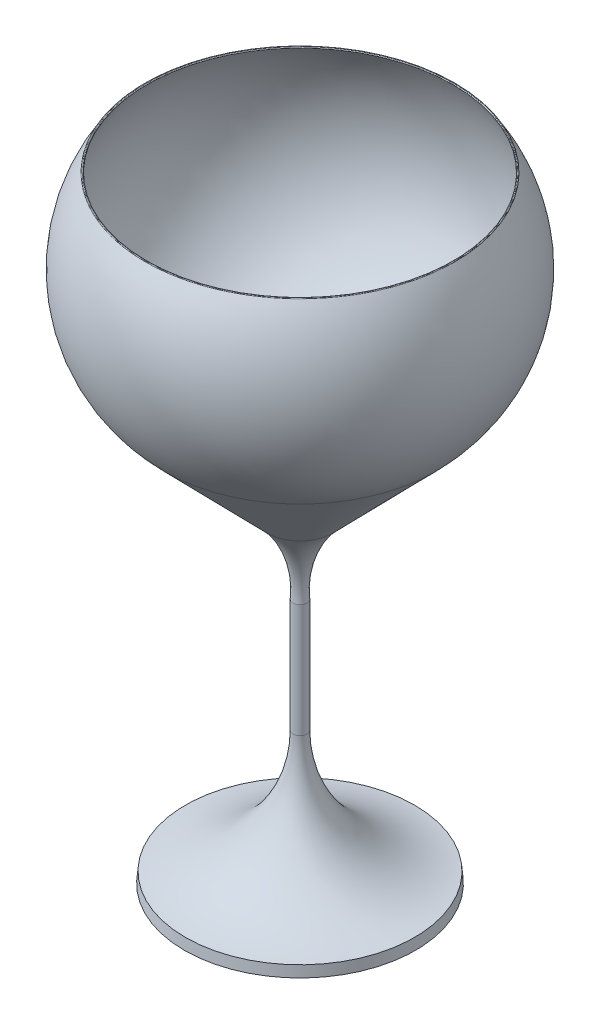
ISO-10303-21;
HEADER;
FILE_DESCRIPTION(('STEP AP214'),'2;1');
FILE_NAME('part.step','',(''),(''),'','','');
FILE_SCHEMA(('AUTOMOTIVE_DESIGN { 1 0 10303 214 1 1 1 1 }'));
ENDSEC;
DATA;
#1=APPLICATION_CONTEXT('core data for automotive mechanical design processes');
#2=APPLICATION_PROTOCOL_DEFINITION('international standard','automotive_design',2000,#1);
#3=PRODUCT_CONTEXT('',#1,'mechanical');
#4=PRODUCT('Part','Part','',(#3));
#5=PRODUCT_RELATED_PRODUCT_CATEGORY('part','',(#4));
#6=PRODUCT_DEFINITION_FORMATION('','',#4);
#7=PRODUCT_DEFINITION_CONTEXT('part definition',#1,'design');
#8=PRODUCT_DEFINITION('design','',#6,#7);
#9=PRODUCT_DEFINITION_SHAPE('','',#8);
#10=(LENGTH_UNIT() NAMED_UNIT(*) SI_UNIT(.MILLI.,.METRE.));
#11=(NAMED_UNIT(*) PLANE_ANGLE_UNIT() SI_UNIT($,.RADIAN.));
#12=(NAMED_UNIT(*) SI_UNIT($,.STERADIAN.) SOLID_ANGLE_UNIT());
#13=UNCERTAINTY_MEASURE_WITH_UNIT(LENGTH_MEASURE(1.E-05),#10,'distance_accuracy_value','');
#14=(GEOMETRIC_REPRESENTATION_CONTEXT(3) GLOBAL_UNCERTAINTY_ASSIGNED_CONTEXT((#13)) GLOBAL_UNIT_ASSIGNED_CONTEXT((#10,
#11,#12)) REPRESENTATION_CONTEXT('',''));
#15=CARTESIAN_POINT('',(0.,0.,0.));
#16=DIRECTION('',(0.,0.,1.));
#17=DIRECTION('',(1.,0.,0.));
#18=AXIS2_PLACEMENT_3D('',#15,#16,#17);
#19=CARTESIAN_POINT('',(0.,-46.,0.));
#20=DIRECTION('',(0.,-1.,0.));
#21=DIRECTION('',(1.,0.,0.));
#22=AXIS2_PLACEMENT_3D('',#19,#20,#21);
#23=SPHERICAL_SURFACE('',#22,50.);
#24=CARTESIAN_POINT('',(0.,0.363636363636365,0.));
#25=DIRECTION('',(0.,-1.,0.));
#26=DIRECTION('',(0.,0.,-1.));
#27=AXIS2_PLACEMENT_3D('',#24,#25,#26);
#28=CIRCLE('',#27,18.7193275290673);
#29=CARTESIAN_POINT('',(0.,0.363636363636365,-18.7193275290673));
#30=VERTEX_POINT('',#29);
#31=EDGE_CURVE('E11',#30,#30,#28,.T.);
#32=ORIENTED_EDGE('',*,*,#31,.T.);
#33=EDGE_LOOP('',(#32));
#34=FACE_BOUND('',#33,.T.);
#35=ADVANCED_FACE('F39',(#34),#23,.F.);
#36=CARTESIAN_POINT('',(0.,5.,0.));
#37=DIRECTION('',(0.,-1.,0.));
#38=DIRECTION('',(0.,0.,-1.));
#39=AXIS2_PLACEMENT_3D('',#36,#37,#38);
#40=TOROIDAL_SURFACE('',#39,20.591260281974,5.);
#41=CARTESIAN_POINT('',(0.,0.,0.));
#42=DIRECTION('',(0.,-1.,0.));
#43=DIRECTION('',(0.,0.,-1.));
#44=AXIS2_PLACEMENT_3D('',#41,#42,#43);
#45=CIRCLE('',#44,20.591260281974);
#46=CARTESIAN_POINT('',(0.,0.,-20.591260281974));
#47=VERTEX_POINT('',#46);
#48=EDGE_CURVE('E44',#47,#47,#45,.T.);
#49=ORIENTED_EDGE('',*,*,#48,.T.);
#50=EDGE_LOOP('',(#49));
#51=FACE_BOUND('',#50,.T.);
#52=ORIENTED_EDGE('',*,*,#31,.F.);
#53=EDGE_LOOP('',(#52));
#54=FACE_BOUND('',#53,.T.);
#55=ADVANCED_FACE('F100',(#51,#54),#40,.T.);
#56=CARTESIAN_POINT('',(0.,0.,0.));
#57=DIRECTION('',(0.,-1.,0.));
#58=DIRECTION('',(0.,0.,-1.));
#59=AXIS2_PLACEMENT_3D('',#56,#57,#58);
#60=PLANE('',#59);
#61=CARTESIAN_POINT('',(0.,0.,0.));
#62=DIRECTION('',(0.,-1.,0.));
#63=DIRECTION('',(0.,0.,-1.));
#64=AXIS2_PLACEMENT_3D('',#61,#62,#63);
#65=CIRCLE('',#64,37.5);
#66=CARTESIAN_POINT('',(0.,0.,-37.5));
#67=VERTEX_POINT('',#66);
#68=EDGE_CURVE('E95',#67,#67,#65,.T.);
#69=ORIENTED_EDGE('',*,*,#68,.T.);
#70=EDGE_LOOP('',(#69));
#71=FACE_BOUND('',#70,.T.);
#72=ORIENTED_EDGE('',*,*,#48,.F.);
#73=EDGE_LOOP('',(#72));
#74=FACE_BOUND('',#73,.T.);
#75=ADVANCED_FACE('F99',(#71,#74),#60,.T.);
#76=CARTESIAN_POINT('',(0.,0.,0.));
#77=DIRECTION('',(0.,-1.,0.));
#78=DIRECTION('',(0.,0.,-1.));
#79=AXIS2_PLACEMENT_3D('',#76,#77,#78);
#80=CONICAL_SURFACE('',#79,37.5,0.0872664625997138);
#81=CARTESIAN_POINT('',(0.,3.5,0.));
#82=DIRECTION('',(0.,-1.,0.));
#83=DIRECTION('',(0.,0.,-1.));
#84=AXIS2_PLACEMENT_3D('',#81,#82,#83);
#85=CIRCLE('',#84,37.1937896776593);
#86=CARTESIAN_POINT('',(0.,3.5,-37.1937896776593));
#87=VERTEX_POINT('',#86);
#88=EDGE_CURVE('E87',#87,#87,#85,.T.);
#89=ORIENTED_EDGE('',*,*,#88,.T.);
#90=EDGE_LOOP('',(#89));
#91=FACE_BOUND('',#90,.T.);
#92=ORIENTED_EDGE('',*,*,#68,.F.);
#93=EDGE_LOOP('',(#92));
#94=FACE_BOUND('',#93,.T.);
#95=ADVANCED_FACE('F105',(#91,#94),#80,.T.);
#96=CARTESIAN_POINT('',(0.,43.1791473846938,0.));
#97=DIRECTION('',(0.,-1.,0.));
#98=DIRECTION('',(0.,0.,-1.));
#99=AXIS2_PLACEMENT_3D('',#96,#97,#98);
#100=TOROIDAL_SURFACE('',#99,42.25,40.);
#101=CARTESIAN_POINT('',(0.,43.1791473846938,0.));
#102=DIRECTION('',(0.,-1.,0.));
#103=DIRECTION('',(0.,0.,-1.));
#104=AXIS2_PLACEMENT_3D('',#101,#102,#103);
#105=CIRCLE('',#104,2.25);
#106=CARTESIAN_POINT('',(0.,43.1791473846938,-2.25));
#107=VERTEX_POINT('',#106);
#108=EDGE_CURVE('E86',#107,#107,#105,.T.);
#109=ORIENTED_EDGE('',*,*,#108,.T.);
#110=EDGE_LOOP('',(#109));
#111=FACE_BOUND('',#110,.T.);
#112=ORIENTED_EDGE('',*,*,#88,.F.);
#113=EDGE_LOOP('',(#112));
#114=FACE_BOUND('',#113,.T.);
#115=ADVANCED_FACE('F109',(#111,#114),#100,.F.);
#116=CARTESIAN_POINT('',(0.,0.,0.));
#117=DIRECTION('',(0.,-1.,0.));
#118=DIRECTION('',(0.,0.,-1.));
#119=AXIS2_PLACEMENT_3D('',#116,#117,#118);
#120=CYLINDRICAL_SURFACE('',#119,2.25);
#121=CARTESIAN_POINT('',(0.,80.,0.));
#122=DIRECTION('',(0.,-1.,0.));
#123=DIRECTION('',(0.,0.,-1.));
#124=AXIS2_PLACEMENT_3D('',#121,#122,#123);
#125=CIRCLE('',#124,2.25);
#126=CARTESIAN_POINT('',(0.,80.,-2.25));
#127=VERTEX_POINT('',#126);
#128=EDGE_CURVE('E81',#127,#127,#125,.T.);
#129=ORIENTED_EDGE('',*,*,#128,.T.);
#130=EDGE_LOOP('',(#129));
#131=FACE_BOUND('',#130,.T.);
#132=ORIENTED_EDGE('',*,*,#108,.F.);
#133=EDGE_LOOP('',(#132));
#134=FACE_BOUND('',#133,.T.);
#135=ADVANCED_FACE('F145',(#131,#134),#120,.T.);
#136=CARTESIAN_POINT('',(0.,82.8683014837877,0.));
#137=DIRECTION('',(0.,-1.,0.));
#138=DIRECTION('',(0.,0.,-1.));
#139=AXIS2_PLACEMENT_3D('',#136,#137,#138);
#140=TOROIDAL_SURFACE('',#139,32.1125659747802,30.);
#141=CARTESIAN_POINT('',(0.,103.877305234815,0.));
#142=DIRECTION('',(0.,-1.,0.));
#143=DIRECTION('',(0.,0.,-1.));
#144=AXIS2_PLACEMENT_3D('',#141,#142,#143);
#145=CIRCLE('',#144,10.6971098416669);
#146=CARTESIAN_POINT('',(0.,103.877305234815,10.6971098416669));
#147=VERTEX_POINT('',#146);
#148=EDGE_CURVE('E79',#147,#147,#145,.T.);
#149=ORIENTED_EDGE('',*,*,#148,.T.);
#150=EDGE_LOOP('',(#149));
#151=FACE_BOUND('',#150,.T.);
#152=ORIENTED_EDGE('',*,*,#128,.F.);
#153=EDGE_LOOP('',(#152));
#154=FACE_BOUND('',#153,.T.);
#155=ADVANCED_FACE('F155',(#151,#154),#140,.F.);
#156=CARTESIAN_POINT('',(0.,103.877305234815,0.));
#157=DIRECTION('',(0.,1.,0.));
#158=DIRECTION('',(0.,0.,1.));
#159=AXIS2_PLACEMENT_3D('',#156,#157,#158);
#160=CONICAL_SURFACE('',#159,10.6971098416669,0.775817842326982);
#161=CARTESIAN_POINT('',(0.,137.771969053965,0.));
#162=DIRECTION('',(0.,-1.,0.));
#163=DIRECTION('',(0.,0.,-1.));
#164=AXIS2_PLACEMENT_3D('',#161,#162,#163);
#165=CIRCLE('',#164,43.9484734778239);
#166=CARTESIAN_POINT('',(0.,137.771969053965,43.9484734778239));
#167=VERTEX_POINT('',#166);
#168=EDGE_CURVE('E77',#167,#167,#165,.T.);
#169=CARTESIAN_POINT('',(0.,137.771969053965,43.9484734778239));
#170=CARTESIAN_POINT('',(0.,137.418899639182,43.6021051066139));
#171=CARTESIAN_POINT('',(0.,137.0658302244,43.2557367354039));
#172=CARTESIAN_POINT('',(0.,136.359691394834,42.562999992984));
#173=CARTESIAN_POINT('',(0.,136.006621980051,42.216631621774));
#174=CARTESIAN_POINT('',(0.,135.300483150486,41.5238948793541));
#175=CARTESIAN_POINT('',(0.,134.947413735703,41.1775265081441));
#176=CARTESIAN_POINT('',(0.,134.241274906137,40.4847897657242));
#177=CARTESIAN_POINT('',(0.,133.888205491354,40.1384213945142));
#178=CARTESIAN_POINT('',(0.,133.182066661789,39.4456846520943));
#179=CARTESIAN_POINT('',(0.,132.828997247006,39.0993162808843));
#180=CARTESIAN_POINT('',(0.,132.12285841744,38.4065795384644));
#181=CARTESIAN_POINT('',(0.,131.769789002657,38.0602111672544));
#182=CARTESIAN_POINT('',(0.,131.063650173092,37.3674744248345));
#183=CARTESIAN_POINT('',(0.,130.710580758309,37.0211060536245));
#184=CARTESIAN_POINT('',(0.,130.004441928743,36.3283693112046));
#185=CARTESIAN_POINT('',(0.,129.651372513961,35.9820009399946));
#186=CARTESIAN_POINT('',(0.,128.945233684395,35.2892641975747));
#187=CARTESIAN_POINT('',(0.,128.592164269612,34.9428958263647));
#188=CARTESIAN_POINT('',(0.,127.886025440047,34.2501590839448));
#189=CARTESIAN_POINT('',(0.,127.532956025264,33.9037907127348));
#190=CARTESIAN_POINT('',(0.,126.826817195698,33.2110539703148));
#191=CARTESIAN_POINT('',(0.,126.473747780915,32.8646855991049));
#192=CARTESIAN_POINT('',(0.,125.76760895135,32.1719488566849));
#193=CARTESIAN_POINT('',(0.,125.414539536567,31.825580485475));
#194=CARTESIAN_POINT('',(0.,124.708400707001,31.132843743055));
#195=CARTESIAN_POINT('',(0.,124.355331292218,30.7864753718451));
#196=CARTESIAN_POINT('',(0.,123.649192462653,30.0937386294251));
#197=CARTESIAN_POINT('',(0.,123.29612304787,29.7473702582152));
#198=CARTESIAN_POINT('',(0.,122.589984218304,29.0546335157952));
#199=CARTESIAN_POINT('',(0.,122.236914803522,28.7082651445853));
#200=CARTESIAN_POINT('',(0.,121.530775973956,28.0155284021653));
#201=CARTESIAN_POINT('',(0.,121.177706559173,27.6691600309554));
#202=CARTESIAN_POINT('',(0.,120.471567729608,26.9764232885354));
#203=CARTESIAN_POINT('',(0.,120.118498314825,26.6300549173254));
#204=CARTESIAN_POINT('',(0.,119.412359485259,25.9373181749055));
#205=CARTESIAN_POINT('',(0.,119.059290070476,25.5909498036955));
#206=CARTESIAN_POINT('',(0.,118.353151240911,24.8982130612756));
#207=CARTESIAN_POINT('',(0.,118.000081826128,24.5518446900656));
#208=CARTESIAN_POINT('',(0.,117.293942996562,23.8591079476457));
#209=CARTESIAN_POINT('',(0.,116.940873581779,23.5127395764357));
#210=CARTESIAN_POINT('',(0.,116.234734752214,22.8200028340158));
#211=CARTESIAN_POINT('',(0.,115.881665337431,22.4736344628058));
#212=CARTESIAN_POINT('',(0.,115.175526507865,21.7808977203859));
#213=CARTESIAN_POINT('',(0.,114.822457093083,21.4345293491759));
#214=CARTESIAN_POINT('',(0.,114.116318263517,20.741792606756));
#215=CARTESIAN_POINT('',(0.,113.763248848734,20.395424235546));
#216=CARTESIAN_POINT('',(0.,113.057110019169,19.7026874931261));
#217=CARTESIAN_POINT('',(0.,112.704040604386,19.3563191219161));
#218=CARTESIAN_POINT('',(0.,111.99790177482,18.6635823794962));
#219=CARTESIAN_POINT('',(0.,111.644832360037,18.3172140082862));
#220=CARTESIAN_POINT('',(0.,110.938693530472,17.6244772658663));
#221=CARTESIAN_POINT('',(0.,110.585624115689,17.2781088946563));
#222=CARTESIAN_POINT('',(0.,109.879485286123,16.5853721522364));
#223=CARTESIAN_POINT('',(0.,109.52641587134,16.2390037810264));
#224=CARTESIAN_POINT('',(0.,108.820277041775,15.5462670386065));
#225=CARTESIAN_POINT('',(0.,108.467207626992,15.1998986673965));
#226=CARTESIAN_POINT('',(0.,107.761068797426,14.5071619249766));
#227=CARTESIAN_POINT('',(0.,107.407999382644,14.1607935537666));
#228=CARTESIAN_POINT('',(0.,106.701860553078,13.4680568113467));
#229=CARTESIAN_POINT('',(0.,106.348791138295,13.1216884401367));
#230=CARTESIAN_POINT('',(0.,105.64265230873,12.4289516977167));
#231=CARTESIAN_POINT('',(0.,105.289582893947,12.0825833265068));
#232=CARTESIAN_POINT('',(0.,104.583444064381,11.3898465840868));
#233=CARTESIAN_POINT('',(0.,104.230374649598,11.0434782128769));
#234=CARTESIAN_POINT('',(0.,103.877305234815,10.6971098416669));
#235=B_SPLINE_CURVE_WITH_KNOTS('',3,(#169,#170,#171,#172,#173,#174,#175,#176,#177,#178,#179,
#180,#181,#182,#183,#184,#185,#186,#187,#188,#189,#190,#191,#192,#193,#194,#195,#196,#197,#198,
#199,#200,#201,#202,#203,#204,#205,#206,#207,#208,#209,#210,#211,#212,#213,#214,#215,#216,#217,
#218,#219,#220,#221,#222,#223,#224,#225,#226,#227,#228,#229,#230,#231,#232,#233,#234),
.UNSPECIFIED.,.F.,.F.,(4,2,2,2,2,2,2,2,2,2,2,2,2,2,2,2,2,2,2,2,2,2,2,2,2,2,2,2,2,2,2,2,4),(0.,
1.48379969742127,2.96759939484257,4.45139909226385,5.93519878968513,7.41899848710642,
8.90279818452771,10.386597881949,11.8703975793703,13.3541972767916,14.8379969742128,
16.3217966716341,17.8055963690554,19.2893960664767,20.773195763898,22.2569954613193,
23.7407951587405,25.2245948561618,26.7083945535831,28.1921942510044,29.6759939484257,
31.159793645847,32.6435933432683,34.1273930406895,35.6111927381108,37.0949924355321,
38.5787921329534,40.0625918303747,41.546391527796,43.0301912252173,44.5139909226385,
45.9977906200598,47.4815903174811),.UNSPECIFIED.);
#236=EDGE_CURVE('BSEAM165',#167,#147,#235,.T.);
#237=ORIENTED_EDGE('',*,*,#168,.T.);
#238=ORIENTED_EDGE('',*,*,#148,.F.);
#239=ORIENTED_EDGE('',*,*,#236,.T.);
#240=ORIENTED_EDGE('',*,*,#236,.F.);
#241=EDGE_LOOP('',(#237,#239,#238,#240));
#242=FACE_BOUND('',#241,.T.);
#243=ADVANCED_FACE('F165',(#242),#160,.T.);
#244=CARTESIAN_POINT('',(0.,172.786975305678,0.));
#245=DIRECTION('',(0.,-1.,0.));
#246=DIRECTION('',(0.,0.,-1.));
#247=AXIS2_PLACEMENT_3D('',#244,#245,#246);
#248=DEGENERATE_TOROIDAL_SURFACE('',#247,8.25604658930109,49.9999999999999,.T.);
#249=ORIENTED_EDGE('',*,*,#168,.F.);
#250=EDGE_LOOP('',(#249));
#251=FACE_BOUND('',#250,.T.);
#252=CARTESIAN_POINT('',(0.,199.908486042961,0.));
#253=DIRECTION('',(0.,-1.,0.));
#254=DIRECTION('',(0.,0.,-1.));
#255=AXIS2_PLACEMENT_3D('',#252,#253,#254);
#256=CIRCLE('',#255,50.2610898023182);
#257=CARTESIAN_POINT('',(0.,199.908486042961,-50.2610898023182));
#258=VERTEX_POINT('',#257);
#259=EDGE_CURVE('E74',#258,#258,#256,.T.);
#260=ORIENTED_EDGE('',*,*,#259,.T.);
#261=EDGE_LOOP('',(#260));
#262=FACE_BOUND('',#261,.T.);
#263=ADVANCED_FACE('F175',(#251,#262),#248,.T.);
#264=CARTESIAN_POINT('',(0.,199.800000000011,0.));
#265=DIRECTION('',(0.,-1.,0.));
#266=DIRECTION('',(0.,0.,-1.));
#267=AXIS2_PLACEMENT_3D('',#264,#265,#266);
#268=TOROIDAL_SURFACE('',#267,50.0930696294661,0.20000000000001);
#269=ORIENTED_EDGE('',*,*,#259,.F.);
#270=EDGE_LOOP('',(#269));
#271=FACE_BOUND('',#270,.T.);
#272=CARTESIAN_POINT('',(0.,200.000000000011,0.));
#273=DIRECTION('',(0.,-1.,0.));
#274=DIRECTION('',(0.,0.,-1.));
#275=AXIS2_PLACEMENT_3D('',#272,#273,#274);
#276=CIRCLE('',#275,50.0930696294661);
#277=CARTESIAN_POINT('',(0.,200.000000000011,-50.0930696294661));
#278=VERTEX_POINT('',#277);
#279=EDGE_CURVE('E73',#278,#278,#276,.T.);
#280=ORIENTED_EDGE('',*,*,#279,.T.);
#281=EDGE_LOOP('',(#280));
#282=FACE_BOUND('',#281,.T.);
#283=ADVANCED_FACE('F185',(#271,#282),#268,.T.);
#284=CARTESIAN_POINT('',(0.,200.000000000011,0.));
#285=DIRECTION('',(0.,-1.,0.));
#286=DIRECTION('',(0.,0.,-1.));
#287=AXIS2_PLACEMENT_3D('',#284,#285,#286);
#288=PLANE('',#287);
#289=ORIENTED_EDGE('',*,*,#279,.F.);
#290=EDGE_LOOP('',(#289));
#291=FACE_BOUND('',#290,.T.);
#292=CARTESIAN_POINT('',(0.,200.000000000011,0.));
#293=DIRECTION('',(0.,-1.,0.));
#294=DIRECTION('',(0.,0.,-1.));
#295=AXIS2_PLACEMENT_3D('',#292,#293,#294);
#296=CIRCLE('',#295,49.9094289719208);
#297=CARTESIAN_POINT('',(0.,200.000000000011,-49.9094289719208));
#298=VERTEX_POINT('',#297);
#299=EDGE_CURVE('E66',#298,#298,#296,.T.);
#300=ORIENTED_EDGE('',*,*,#299,.T.);
#301=EDGE_LOOP('',(#300));
#302=FACE_BOUND('',#301,.T.);
#303=ADVANCED_FACE('F195',(#291,#302),#288,.F.);
#304=CARTESIAN_POINT('',(0.,199.800000000011,0.));
#305=DIRECTION('',(0.,-1.,0.));
#306=DIRECTION('',(0.,0.,-1.));
#307=AXIS2_PLACEMENT_3D('',#304,#305,#306);
#308=TOROIDAL_SURFACE('',#307,49.909428971923,0.20000000000093);
#309=CARTESIAN_POINT('',(0.,199.691177050079,0.));
#310=DIRECTION('',(0.,-1.,0.));
#311=DIRECTION('',(0.,0.,-1.));
#312=AXIS2_PLACEMENT_3D('',#309,#310,#311);
#313=CIRCLE('',#312,49.7416268099336);
#314=CARTESIAN_POINT('',(0.,199.691177050079,-49.7416268099336));
#315=VERTEX_POINT('',#314);
#316=EDGE_CURVE('E62',#315,#315,#313,.T.);
#317=ORIENTED_EDGE('',*,*,#316,.T.);
#318=EDGE_LOOP('',(#317));
#319=FACE_BOUND('',#318,.T.);
#320=ORIENTED_EDGE('',*,*,#299,.F.);
#321=EDGE_LOOP('',(#320));
#322=FACE_BOUND('',#321,.T.);
#323=ADVANCED_FACE('F205',(#319,#322),#308,.T.);
#324=CARTESIAN_POINT('',(0.,172.786975305678,0.));
#325=DIRECTION('',(0.,-1.,0.));
#326=DIRECTION('',(0.,0.,-1.));
#327=AXIS2_PLACEMENT_3D('',#324,#325,#326);
#328=DEGENERATE_TOROIDAL_SURFACE('',#327,8.25604658930109,49.4458232588558,.T.);
#329=CARTESIAN_POINT('',(0.,135.158943709578,0.));
#330=DIRECTION('',(0.,-1.,0.));
#331=DIRECTION('',(0.,0.,-1.));
#332=AXIS2_PLACEMENT_3D('',#329,#330,#331);
#333=CIRCLE('',#332,40.3343987282292);
#334=CARTESIAN_POINT('',(0.,135.158943709578,40.3343987282292));
#335=VERTEX_POINT('',#334);
#336=EDGE_CURVE('E58',#335,#335,#333,.T.);
#337=ORIENTED_EDGE('',*,*,#336,.T.);
#338=EDGE_LOOP('',(#337));
#339=FACE_BOUND('',#338,.T.);
#340=ORIENTED_EDGE('',*,*,#316,.F.);
#341=EDGE_LOOP('',(#340));
#342=FACE_BOUND('',#341,.T.);
#343=ADVANCED_FACE('F212',(#339,#342),#328,.F.);
#344=CARTESIAN_POINT('',(0.,135.158943709578,0.));
#345=DIRECTION('',(0.,1.,0.));
#346=DIRECTION('',(0.,0.,1.));
#347=AXIS2_PLACEMENT_3D('',#344,#345,#346);
#348=CONICAL_SURFACE('',#347,40.3343987282292,0.775817842326998);
#349=CARTESIAN_POINT('',(0.,104.656574631399,0.));
#350=DIRECTION('',(0.,-1.,0.));
#351=DIRECTION('',(0.,0.,-1.));
#352=AXIS2_PLACEMENT_3D('',#349,#350,#351);
#353=CIRCLE('',#352,10.4109461342011);
#354=CARTESIAN_POINT('',(0.,104.656574631399,10.4109461342011));
#355=VERTEX_POINT('',#354);
#356=EDGE_CURVE('E60',#355,#355,#353,.T.);
#357=CARTESIAN_POINT('',(0.,104.656574631399,10.4109461342011));
#358=CARTESIAN_POINT('',(0.,104.97430764263,10.7226487653889));
#359=CARTESIAN_POINT('',(0.,105.292040653861,11.0343513965767));
#360=CARTESIAN_POINT('',(0.,105.927506676323,11.6577566589523));
#361=CARTESIAN_POINT('',(0.,106.245239687554,11.9694592901401));
#362=CARTESIAN_POINT('',(0.,106.880705710016,12.5928645525157));
#363=CARTESIAN_POINT('',(0.,107.198438721247,12.9045671837035));
#364=CARTESIAN_POINT('',(0.,107.833904743709,13.527972446079));
#365=CARTESIAN_POINT('',(0.,108.15163775494,13.8396750772668));
#366=CARTESIAN_POINT('',(0.,108.787103777402,14.4630803396424));
#367=CARTESIAN_POINT('',(0.,109.104836788633,14.7747829708302));
#368=CARTESIAN_POINT('',(0.,109.740302811095,15.3981882332058));
#369=CARTESIAN_POINT('',(0.,110.058035822326,15.7098908643936));
#370=CARTESIAN_POINT('',(0.,110.693501844788,16.3332961267692));
#371=CARTESIAN_POINT('',(0.,111.011234856019,16.644998757957));
#372=CARTESIAN_POINT('',(0.,111.646700878481,17.2684040203326));
#373=CARTESIAN_POINT('',(0.,111.964433889712,17.5801066515204));
#374=CARTESIAN_POINT('',(0.,112.599899912175,18.2035119138959));
#375=CARTESIAN_POINT('',(0.,112.917632923406,18.5152145450837));
#376=CARTESIAN_POINT('',(0.,113.553098945868,19.1386198074593));
#377=CARTESIAN_POINT('',(0.,113.870831957099,19.4503224386471));
#378=CARTESIAN_POINT('',(0.,114.506297979561,20.0737277010227));
#379=CARTESIAN_POINT('',(0.,114.824030990792,20.3854303322105));
#380=CARTESIAN_POINT('',(0.,115.459497013254,21.0088355945861));
#381=CARTESIAN_POINT('',(0.,115.777230024485,21.3205382257739));
#382=CARTESIAN_POINT('',(0.,116.412696046947,21.9439434881495));
#383=CARTESIAN_POINT('',(0.,116.730429058178,22.2556461193372));
#384=CARTESIAN_POINT('',(0.,117.36589508064,22.8790513817128));
#385=CARTESIAN_POINT('',(0.,117.683628091871,23.1907540129006));
#386=CARTESIAN_POINT('',(0.,118.319094114333,23.8141592752762));
#387=CARTESIAN_POINT('',(0.,118.636827125564,24.125861906464));
#388=CARTESIAN_POINT('',(0.,119.272293148026,24.7492671688396));
#389=CARTESIAN_POINT('',(0.,119.590026159257,25.0609698000274));
#390=CARTESIAN_POINT('',(0.,120.225492181719,25.684375062403));
#391=CARTESIAN_POINT('',(0.,120.54322519295,25.9960776935908));
#392=CARTESIAN_POINT('',(0.,121.178691215412,26.6194829559664));
#393=CARTESIAN_POINT('',(0.,121.496424226644,26.9311855871541));
#394=CARTESIAN_POINT('',(0.,122.131890249106,27.5545908495297));
#395=CARTESIAN_POINT('',(0.,122.449623260337,27.8662934807175));
#396=CARTESIAN_POINT('',(0.,123.085089282799,28.4896987430931));
#397=CARTESIAN_POINT('',(0.,123.40282229403,28.8014013742809));
#398=CARTESIAN_POINT('',(0.,124.038288316492,29.4248066366565));
#399=CARTESIAN_POINT('',(0.,124.356021327723,29.7365092678443));
#400=CARTESIAN_POINT('',(0.,124.991487350185,30.3599145302199));
#401=CARTESIAN_POINT('',(0.,125.309220361416,30.6716171614077));
#402=CARTESIAN_POINT('',(0.,125.944686383878,31.2950224237832));
#403=CARTESIAN_POINT('',(0.,126.262419395109,31.606725054971));
#404=CARTESIAN_POINT('',(0.,126.897885417571,32.2301303173466));
#405=CARTESIAN_POINT('',(0.,127.215618428802,32.5418329485344));
#406=CARTESIAN_POINT('',(0.,127.851084451264,33.16523821091));
#407=CARTESIAN_POINT('',(0.,128.168817462495,33.4769408420978));
#408=CARTESIAN_POINT('',(0.,128.804283484957,34.1003461044734));
#409=CARTESIAN_POINT('',(0.,129.122016496188,34.4120487356612));
#410=CARTESIAN_POINT('',(0.,129.75748251865,35.0354539980368));
#411=CARTESIAN_POINT('',(0.,130.075215529881,35.3471566292245));
#412=CARTESIAN_POINT('',(0.,130.710681552344,35.9705618916001));
#413=CARTESIAN_POINT('',(0.,131.028414563575,36.2822645227879));
#414=CARTESIAN_POINT('',(0.,131.663880586037,36.9056697851635));
#415=CARTESIAN_POINT('',(0.,131.981613597268,37.2173724163513));
#416=CARTESIAN_POINT('',(0.,132.61707961973,37.8407776787269));
#417=CARTESIAN_POINT('',(0.,132.934812630961,38.1524803099147));
#418=CARTESIAN_POINT('',(0.,133.570278653423,38.7758855722903));
#419=CARTESIAN_POINT('',(0.,133.888011664654,39.0875882034781));
#420=CARTESIAN_POINT('',(0.,134.523477687116,39.7109934658536));
#421=CARTESIAN_POINT('',(0.,134.841210698347,40.0226960970414));
#422=CARTESIAN_POINT('',(0.,135.158943709578,40.3343987282292));
#423=B_SPLINE_CURVE_WITH_KNOTS('',3,(#357,#358,#359,#360,#361,#362,#363,#364,#365,#366,#367,
#368,#369,#370,#371,#372,#373,#374,#375,#376,#377,#378,#379,#380,#381,#382,#383,#384,#385,#386,
#387,#388,#389,#390,#391,#392,#393,#394,#395,#396,#397,#398,#399,#400,#401,#402,#403,#404,#405,
#406,#407,#408,#409,#410,#411,#412,#413,#414,#415,#416,#417,#418,#419,#420,#421,#422),
.UNSPECIFIED.,.F.,.F.,(4,2,2,2,2,2,2,2,2,2,2,2,2,2,2,2,2,2,2,2,2,2,2,2,2,2,2,2,2,2,2,2,4),(0.,
1.33529591118899,2.67059182237796,4.00588773356695,5.34118364475592,6.67647955594491,
8.01177546713388,9.34707137832287,10.6823672895118,12.0176632007008,13.3529591118898,
14.6882550230788,16.0235509342678,17.3588468454568,18.6941427566457,20.0294386678347,
21.3647345790237,22.7000304902127,24.0353264014017,25.3706223125906,26.7059182237796,
28.0412141349686,29.3765100461576,30.7118059573466,32.0471018685355,33.3823977797245,
34.7176936909135,36.0529896021025,37.3882855132914,38.7235814244804,40.0588773356694,
41.3941732468584,42.7294691580474),.UNSPECIFIED.);
#424=EDGE_CURVE('BSEAM225',#355,#335,#423,.T.);
#425=ORIENTED_EDGE('',*,*,#356,.T.);
#426=ORIENTED_EDGE('',*,*,#336,.F.);
#427=ORIENTED_EDGE('',*,*,#424,.T.);
#428=ORIENTED_EDGE('',*,*,#424,.F.);
#429=EDGE_LOOP('',(#425,#427,#426,#428));
#430=FACE_BOUND('',#429,.T.);
#431=ADVANCED_FACE('F225',(#430),#348,.F.);
#432=CARTESIAN_POINT('',(0.,108.15807525657,0.));
#433=DIRECTION('',(0.,-1.,0.));
#434=DIRECTION('',(0.,0.,-1.));
#435=AXIS2_PLACEMENT_3D('',#432,#433,#434);
#436=TOROIDAL_SURFACE('',#435,6.84170344534896,5.0000000000001);
#437=CARTESIAN_POINT('',(0.,103.158792944701,0.));
#438=DIRECTION('',(0.,-1.,0.));
#439=DIRECTION('',(0.,0.,-1.));
#440=AXIS2_PLACEMENT_3D('',#437,#438,#439);
#441=CIRCLE('',#440,6.92641688129683);
#442=CARTESIAN_POINT('',(0.,103.158792944701,-6.92641688129683));
#443=VERTEX_POINT('',#442);
#444=EDGE_CURVE('E54',#443,#443,#441,.T.);
#445=ORIENTED_EDGE('',*,*,#444,.T.);
#446=EDGE_LOOP('',(#445));
#447=FACE_BOUND('',#446,.T.);
#448=ORIENTED_EDGE('',*,*,#356,.F.);
#449=EDGE_LOOP('',(#448));
#450=FACE_BOUND('',#449,.T.);
#451=ADVANCED_FACE('F51',(#447,#450),#436,.F.);
#452=CARTESIAN_POINT('',(0.,395.713171338151,59.4959865893839));
#453=DIRECTION('',(-1.,0.,0.));
#454=DIRECTION('',(0.,0.,-1.));
#455=AXIS2_PLACEMENT_3D('',#452,#453,#454);
#456=CIRCLE('',#455,300.);
#457=TRIMMED_CURVE('',#456,(PARAMETER_VALUE(-1.37115279531446)),
(PARAMETER_VALUE(1.37115279531446)),.T.,.PARAMETER.);
#458=CARTESIAN_POINT('',(0.,395.713171338151,0.));
#459=DIRECTION('',(0.,-1.,0.));
#460=AXIS1_PLACEMENT('',#458,#459);
#461=SURFACE_OF_REVOLUTION('',#457,#460);
#462=CARTESIAN_POINT('',(0.,101.671970858089,0.));
#463=VERTEX_POINT('',#462);
#464=VERTEX_LOOP('',#463);
#465=FACE_BOUND('',#464,.T.);
#466=ORIENTED_EDGE('',*,*,#444,.F.);
#467=EDGE_LOOP('',(#466));
#468=FACE_BOUND('',#467,.T.);
#469=ADVANCED_FACE('F48',(#465,#468),#461,.F.);
#470=CLOSED_SHELL('',(#35,#55,#75,#95,#115,#135,#155,#243,#263,#283,#303,#323,#343,#431,#451,#469));
#471=MANIFOLD_SOLID_BREP('B2',#470);
#472=ADVANCED_BREP_SHAPE_REPRESENTATION('',(#18,#471),#14);
#473=SHAPE_DEFINITION_REPRESENTATION(#9,#472);
ENDSEC;
END-ISO-10303-21;
